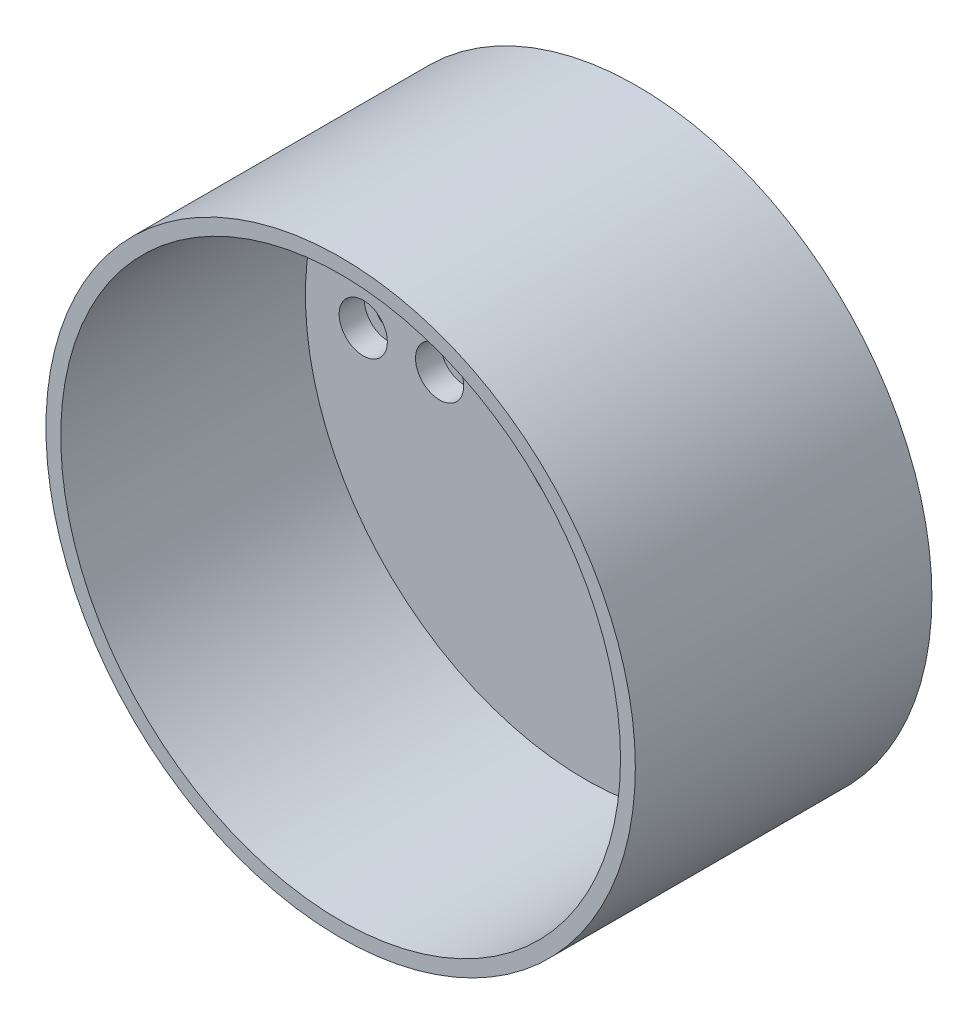
ISO-10303-21;
HEADER;
FILE_DESCRIPTION(('STEP AP214'),'2;1');
FILE_NAME('part.step','',(''),(''),'','','');
FILE_SCHEMA(('AUTOMOTIVE_DESIGN { 1 0 10303 214 1 1 1 1 }'));
ENDSEC;
DATA;
#1=APPLICATION_CONTEXT('core data for automotive mechanical design processes');
#2=APPLICATION_PROTOCOL_DEFINITION('international standard','automotive_design',2000,#1);
#3=PRODUCT_CONTEXT('',#1,'mechanical');
#4=PRODUCT('Part','Part','',(#3));
#5=PRODUCT_RELATED_PRODUCT_CATEGORY('part','',(#4));
#6=PRODUCT_DEFINITION_FORMATION('','',#4);
#7=PRODUCT_DEFINITION_CONTEXT('part definition',#1,'design');
#8=PRODUCT_DEFINITION('design','',#6,#7);
#9=PRODUCT_DEFINITION_SHAPE('','',#8);
#10=(LENGTH_UNIT() NAMED_UNIT(*) SI_UNIT(.MILLI.,.METRE.));
#11=(NAMED_UNIT(*) PLANE_ANGLE_UNIT() SI_UNIT($,.RADIAN.));
#12=(NAMED_UNIT(*) SI_UNIT($,.STERADIAN.) SOLID_ANGLE_UNIT());
#13=UNCERTAINTY_MEASURE_WITH_UNIT(LENGTH_MEASURE(1.E-05),#10,'distance_accuracy_value','');
#14=(GEOMETRIC_REPRESENTATION_CONTEXT(3) GLOBAL_UNCERTAINTY_ASSIGNED_CONTEXT((#13)) GLOBAL_UNIT_ASSIGNED_CONTEXT((#10,
#11,#12)) REPRESENTATION_CONTEXT('',''));
#15=CARTESIAN_POINT('',(0.,0.,0.));
#16=DIRECTION('',(0.,0.,1.));
#17=DIRECTION('',(1.,0.,0.));
#18=AXIS2_PLACEMENT_3D('',#15,#16,#17);
#19=CARTESIAN_POINT('',(0.,0.,7.));
#20=DIRECTION('',(0.,0.,1.));
#21=DIRECTION('',(1.,0.,0.));
#22=AXIS2_PLACEMENT_3D('',#19,#20,#21);
#23=PLANE('',#22);
#24=CARTESIAN_POINT('',(-29.95,0.,7.));
#25=DIRECTION('',(0.,0.,1.));
#26=DIRECTION('',(1.,0.,0.));
#27=AXIS2_PLACEMENT_3D('',#24,#25,#26);
#28=CIRCLE('',#27,3.25);
#29=CARTESIAN_POINT('',(-26.7,0.,7.));
#30=VERTEX_POINT('',#29);
#31=EDGE_CURVE('E84',#30,#30,#28,.T.);
#32=ORIENTED_EDGE('',*,*,#31,.F.);
#33=EDGE_LOOP('',(#32));
#34=FACE_BOUND('',#33,.T.);
#35=CARTESIAN_POINT('',(-19.65,0.,7.));
#36=DIRECTION('',(0.,0.,1.));
#37=DIRECTION('',(1.,0.,0.));
#38=AXIS2_PLACEMENT_3D('',#35,#36,#37);
#39=CIRCLE('',#38,3.25);
#40=CARTESIAN_POINT('',(-16.4,0.,7.));
#41=VERTEX_POINT('',#40);
#42=EDGE_CURVE('E72',#41,#41,#39,.T.);
#43=ORIENTED_EDGE('',*,*,#42,.F.);
#44=EDGE_LOOP('',(#43));
#45=FACE_BOUND('',#44,.T.);
#46=CARTESIAN_POINT('',(0.,0.,7.));
#47=DIRECTION('',(0.,0.,1.));
#48=DIRECTION('',(1.,0.,0.));
#49=AXIS2_PLACEMENT_3D('',#46,#47,#48);
#50=CIRCLE('',#49,37.75);
#51=CARTESIAN_POINT('',(37.75,0.,7.));
#52=VERTEX_POINT('',#51);
#53=EDGE_CURVE('E50',#52,#52,#50,.F.);
#54=ORIENTED_EDGE('',*,*,#53,.F.);
#55=EDGE_LOOP('',(#54));
#56=FACE_BOUND('',#55,.T.);
#57=CARTESIAN_POINT('',(0.,0.,7.));
#58=DIRECTION('',(0.,0.,1.));
#59=DIRECTION('',(1.,0.,0.));
#60=AXIS2_PLACEMENT_3D('',#57,#58,#59);
#61=CIRCLE('',#60,9.);
#62=CARTESIAN_POINT('',(9.,0.,7.));
#63=VERTEX_POINT('',#62);
#64=EDGE_CURVE('E11',#63,#63,#61,.T.);
#65=ORIENTED_EDGE('',*,*,#64,.F.);
#66=EDGE_LOOP('',(#65));
#67=FACE_BOUND('',#66,.T.);
#68=ADVANCED_FACE('F39',(#34,#45,#56,#67),#23,.T.);
#69=CARTESIAN_POINT('',(0.,0.,0.));
#70=DIRECTION('',(0.,0.,1.));
#71=DIRECTION('',(1.,0.,0.));
#72=AXIS2_PLACEMENT_3D('',#69,#70,#71);
#73=PLANE('',#72);
#74=CARTESIAN_POINT('',(-29.95,0.,0.));
#75=DIRECTION('',(0.,0.,1.));
#76=DIRECTION('',(1.,0.,0.));
#77=AXIS2_PLACEMENT_3D('',#74,#75,#76);
#78=CIRCLE('',#77,1.7);
#79=CARTESIAN_POINT('',(-28.25,0.,0.));
#80=VERTEX_POINT('',#79);
#81=EDGE_CURVE('E75',#80,#80,#78,.T.);
#82=ORIENTED_EDGE('',*,*,#81,.T.);
#83=EDGE_LOOP('',(#82));
#84=FACE_BOUND('',#83,.T.);
#85=CARTESIAN_POINT('',(-19.65,0.,0.));
#86=DIRECTION('',(0.,0.,1.));
#87=DIRECTION('',(1.,0.,0.));
#88=AXIS2_PLACEMENT_3D('',#85,#86,#87);
#89=CIRCLE('',#88,1.7);
#90=CARTESIAN_POINT('',(-17.95,0.,0.));
#91=VERTEX_POINT('',#90);
#92=EDGE_CURVE('E59',#91,#91,#89,.T.);
#93=ORIENTED_EDGE('',*,*,#92,.T.);
#94=EDGE_LOOP('',(#93));
#95=FACE_BOUND('',#94,.T.);
#96=CARTESIAN_POINT('',(0.,0.,0.));
#97=DIRECTION('',(0.,0.,1.));
#98=DIRECTION('',(1.,0.,0.));
#99=AXIS2_PLACEMENT_3D('',#96,#97,#98);
#100=CIRCLE('',#99,9.);
#101=CARTESIAN_POINT('',(9.,0.,0.));
#102=VERTEX_POINT('',#101);
#103=EDGE_CURVE('E43',#102,#102,#100,.T.);
#104=ORIENTED_EDGE('',*,*,#103,.T.);
#105=EDGE_LOOP('',(#104));
#106=FACE_BOUND('',#105,.T.);
#107=CARTESIAN_POINT('',(0.,0.,0.));
#108=DIRECTION('',(0.,0.,1.));
#109=DIRECTION('',(1.,0.,0.));
#110=AXIS2_PLACEMENT_3D('',#107,#108,#109);
#111=CIRCLE('',#110,39.75);
#112=CARTESIAN_POINT('',(39.75,0.,0.));
#113=VERTEX_POINT('',#112);
#114=EDGE_CURVE('E55',#113,#113,#111,.T.);
#115=ORIENTED_EDGE('',*,*,#114,.F.);
#116=EDGE_LOOP('',(#115));
#117=FACE_BOUND('',#116,.T.);
#118=ADVANCED_FACE('F41',(#84,#95,#106,#117),#73,.F.);
#119=CARTESIAN_POINT('',(0.,0.,7.));
#120=DIRECTION('',(0.,0.,-1.));
#121=DIRECTION('',(-1.,0.,0.));
#122=AXIS2_PLACEMENT_3D('',#119,#120,#121);
#123=CYLINDRICAL_SURFACE('',#122,9.);
#124=ORIENTED_EDGE('',*,*,#64,.T.);
#125=EDGE_LOOP('',(#124));
#126=FACE_BOUND('',#125,.T.);
#127=ORIENTED_EDGE('',*,*,#103,.F.);
#128=EDGE_LOOP('',(#127));
#129=FACE_BOUND('',#128,.T.);
#130=ADVANCED_FACE('F101',(#126,#129),#123,.F.);
#131=CARTESIAN_POINT('',(0.,0.,40.));
#132=DIRECTION('',(0.,0.,-1.));
#133=DIRECTION('',(-1.,0.,0.));
#134=AXIS2_PLACEMENT_3D('',#131,#132,#133);
#135=CYLINDRICAL_SURFACE('',#134,37.75);
#136=ORIENTED_EDGE('',*,*,#53,.T.);
#137=EDGE_LOOP('',(#136));
#138=FACE_BOUND('',#137,.T.);
#139=CARTESIAN_POINT('',(0.,0.,40.));
#140=DIRECTION('',(0.,0.,1.));
#141=DIRECTION('',(1.,0.,0.));
#142=AXIS2_PLACEMENT_3D('',#139,#140,#141);
#143=CIRCLE('',#142,37.75);
#144=CARTESIAN_POINT('',(37.75,0.,40.));
#145=VERTEX_POINT('',#144);
#146=EDGE_CURVE('E58',#145,#145,#143,.T.);
#147=ORIENTED_EDGE('',*,*,#146,.T.);
#148=EDGE_LOOP('',(#147));
#149=FACE_BOUND('',#148,.T.);
#150=ADVANCED_FACE('F97',(#138,#149),#135,.F.);
#151=CARTESIAN_POINT('',(0.,0.,40.));
#152=DIRECTION('',(0.,0.,-1.));
#153=DIRECTION('',(-1.,0.,0.));
#154=AXIS2_PLACEMENT_3D('',#151,#152,#153);
#155=CYLINDRICAL_SURFACE('',#154,39.75);
#156=CARTESIAN_POINT('',(0.,0.,40.));
#157=DIRECTION('',(0.,0.,1.));
#158=DIRECTION('',(1.,0.,0.));
#159=AXIS2_PLACEMENT_3D('',#156,#157,#158);
#160=CIRCLE('',#159,39.75);
#161=CARTESIAN_POINT('',(39.75,0.,40.));
#162=VERTEX_POINT('',#161);
#163=EDGE_CURVE('E54',#162,#162,#160,.T.);
#164=ORIENTED_EDGE('',*,*,#163,.F.);
#165=EDGE_LOOP('',(#164));
#166=FACE_BOUND('',#165,.T.);
#167=ORIENTED_EDGE('',*,*,#114,.T.);
#168=EDGE_LOOP('',(#167));
#169=FACE_BOUND('',#168,.T.);
#170=ADVANCED_FACE('F100',(#166,#169),#155,.T.);
#171=CARTESIAN_POINT('',(0.,0.,40.));
#172=DIRECTION('',(0.,0.,1.));
#173=DIRECTION('',(1.,0.,0.));
#174=AXIS2_PLACEMENT_3D('',#171,#172,#173);
#175=PLANE('',#174);
#176=ORIENTED_EDGE('',*,*,#146,.F.);
#177=EDGE_LOOP('',(#176));
#178=FACE_BOUND('',#177,.T.);
#179=ORIENTED_EDGE('',*,*,#163,.T.);
#180=EDGE_LOOP('',(#179));
#181=FACE_BOUND('',#180,.T.);
#182=ADVANCED_FACE('F105',(#178,#181),#175,.T.);
#183=CARTESIAN_POINT('',(-19.65,0.,7.));
#184=DIRECTION('',(0.,0.,1.));
#185=DIRECTION('',(1.,0.,0.));
#186=AXIS2_PLACEMENT_3D('',#183,#184,#185);
#187=CYLINDRICAL_SURFACE('',#186,1.7);
#188=ORIENTED_EDGE('',*,*,#92,.F.);
#189=EDGE_LOOP('',(#188));
#190=FACE_BOUND('',#189,.T.);
#191=CARTESIAN_POINT('',(-19.65,0.,3.6));
#192=DIRECTION('',(0.,0.,1.));
#193=DIRECTION('',(1.,0.,0.));
#194=AXIS2_PLACEMENT_3D('',#191,#192,#193);
#195=CIRCLE('',#194,1.7);
#196=CARTESIAN_POINT('',(-17.95,0.,3.6));
#197=VERTEX_POINT('',#196);
#198=EDGE_CURVE('E66',#197,#197,#195,.T.);
#199=ORIENTED_EDGE('',*,*,#198,.T.);
#200=EDGE_LOOP('',(#199));
#201=FACE_BOUND('',#200,.T.);
#202=ADVANCED_FACE('F108',(#190,#201),#187,.F.);
#203=CARTESIAN_POINT('',(-17.95,0.,3.6));
#204=DIRECTION('',(0.,0.,-1.));
#205=DIRECTION('',(-1.,0.,0.));
#206=AXIS2_PLACEMENT_3D('',#203,#204,#205);
#207=PLANE('',#206);
#208=ORIENTED_EDGE('',*,*,#198,.F.);
#209=EDGE_LOOP('',(#208));
#210=FACE_BOUND('',#209,.T.);
#211=CARTESIAN_POINT('',(-19.65,0.,3.6));
#212=DIRECTION('',(0.,0.,1.));
#213=DIRECTION('',(1.,0.,0.));
#214=AXIS2_PLACEMENT_3D('',#211,#212,#213);
#215=CIRCLE('',#214,3.25);
#216=CARTESIAN_POINT('',(-16.4,0.,3.6));
#217=VERTEX_POINT('',#216);
#218=EDGE_CURVE('E69',#217,#217,#215,.T.);
#219=ORIENTED_EDGE('',*,*,#218,.T.);
#220=EDGE_LOOP('',(#219));
#221=FACE_BOUND('',#220,.T.);
#222=ADVANCED_FACE('F132',(#210,#221),#207,.F.);
#223=CARTESIAN_POINT('',(-19.65,0.,7.));
#224=DIRECTION('',(0.,0.,1.));
#225=DIRECTION('',(1.,0.,0.));
#226=AXIS2_PLACEMENT_3D('',#223,#224,#225);
#227=CYLINDRICAL_SURFACE('',#226,3.25);
#228=ORIENTED_EDGE('',*,*,#218,.F.);
#229=EDGE_LOOP('',(#228));
#230=FACE_BOUND('',#229,.T.);
#231=ORIENTED_EDGE('',*,*,#42,.T.);
#232=EDGE_LOOP('',(#231));
#233=FACE_BOUND('',#232,.T.);
#234=ADVANCED_FACE('F138',(#230,#233),#227,.F.);
#235=CARTESIAN_POINT('',(-29.95,0.,7.));
#236=DIRECTION('',(0.,0.,1.));
#237=DIRECTION('',(1.,0.,0.));
#238=AXIS2_PLACEMENT_3D('',#235,#236,#237);
#239=CYLINDRICAL_SURFACE('',#238,1.7);
#240=ORIENTED_EDGE('',*,*,#81,.F.);
#241=EDGE_LOOP('',(#240));
#242=FACE_BOUND('',#241,.T.);
#243=CARTESIAN_POINT('',(-29.95,0.,3.6));
#244=DIRECTION('',(0.,0.,1.));
#245=DIRECTION('',(1.,0.,0.));
#246=AXIS2_PLACEMENT_3D('',#243,#244,#245);
#247=CIRCLE('',#246,1.7);
#248=CARTESIAN_POINT('',(-28.25,0.,3.6));
#249=VERTEX_POINT('',#248);
#250=EDGE_CURVE('E78',#249,#249,#247,.T.);
#251=ORIENTED_EDGE('',*,*,#250,.T.);
#252=EDGE_LOOP('',(#251));
#253=FACE_BOUND('',#252,.T.);
#254=ADVANCED_FACE('F144',(#242,#253),#239,.F.);
#255=CARTESIAN_POINT('',(-28.25,0.,3.6));
#256=DIRECTION('',(0.,0.,-1.));
#257=DIRECTION('',(-1.,0.,0.));
#258=AXIS2_PLACEMENT_3D('',#255,#256,#257);
#259=PLANE('',#258);
#260=ORIENTED_EDGE('',*,*,#250,.F.);
#261=EDGE_LOOP('',(#260));
#262=FACE_BOUND('',#261,.T.);
#263=CARTESIAN_POINT('',(-29.95,0.,3.6));
#264=DIRECTION('',(0.,0.,1.));
#265=DIRECTION('',(1.,0.,0.));
#266=AXIS2_PLACEMENT_3D('',#263,#264,#265);
#267=CIRCLE('',#266,3.25);
#268=CARTESIAN_POINT('',(-26.7,0.,3.6));
#269=VERTEX_POINT('',#268);
#270=EDGE_CURVE('E81',#269,#269,#267,.T.);
#271=ORIENTED_EDGE('',*,*,#270,.T.);
#272=EDGE_LOOP('',(#271));
#273=FACE_BOUND('',#272,.T.);
#274=ADVANCED_FACE('F149',(#262,#273),#259,.F.);
#275=CARTESIAN_POINT('',(-29.95,0.,7.));
#276=DIRECTION('',(0.,0.,1.));
#277=DIRECTION('',(1.,0.,0.));
#278=AXIS2_PLACEMENT_3D('',#275,#276,#277);
#279=CYLINDRICAL_SURFACE('',#278,3.25);
#280=ORIENTED_EDGE('',*,*,#270,.F.);
#281=EDGE_LOOP('',(#280));
#282=FACE_BOUND('',#281,.T.);
#283=ORIENTED_EDGE('',*,*,#31,.T.);
#284=EDGE_LOOP('',(#283));
#285=FACE_BOUND('',#284,.T.);
#286=ADVANCED_FACE('F88',(#282,#285),#279,.F.);
#287=CLOSED_SHELL('',(#68,#118,#130,#150,#170,#182,#202,#222,#234,#254,#274,#286));
#288=MANIFOLD_SOLID_BREP('B2',#287);
#289=ADVANCED_BREP_SHAPE_REPRESENTATION('',(#18,#288),#14);
#290=SHAPE_DEFINITION_REPRESENTATION(#9,#289);
ENDSEC;
END-ISO-10303-21;
